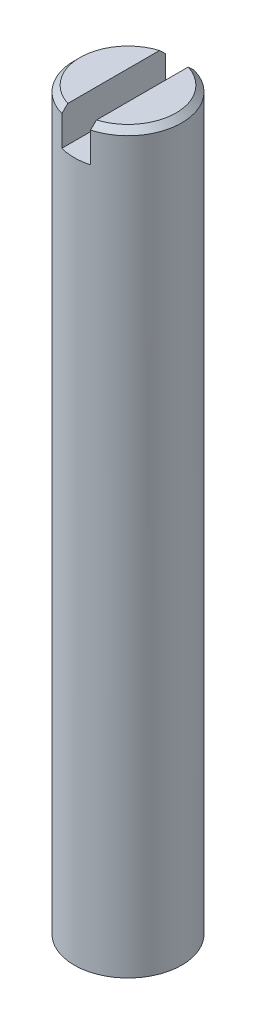
ISO-10303-21;
HEADER;
FILE_DESCRIPTION(('STEP AP214'),'2;1');
FILE_NAME('part.step','',(''),(''),'','','');
FILE_SCHEMA(('AUTOMOTIVE_DESIGN { 1 0 10303 214 1 1 1 1 }'));
ENDSEC;
DATA;
#1=APPLICATION_CONTEXT('core data for automotive mechanical design processes');
#2=APPLICATION_PROTOCOL_DEFINITION('international standard','automotive_design',2000,#1);
#3=PRODUCT_CONTEXT('',#1,'mechanical');
#4=PRODUCT('Part','Part','',(#3));
#5=PRODUCT_RELATED_PRODUCT_CATEGORY('part','',(#4));
#6=PRODUCT_DEFINITION_FORMATION('','',#4);
#7=PRODUCT_DEFINITION_CONTEXT('part definition',#1,'design');
#8=PRODUCT_DEFINITION('design','',#6,#7);
#9=PRODUCT_DEFINITION_SHAPE('','',#8);
#10=(LENGTH_UNIT() NAMED_UNIT(*) SI_UNIT(.MILLI.,.METRE.));
#11=(NAMED_UNIT(*) PLANE_ANGLE_UNIT() SI_UNIT($,.RADIAN.));
#12=(NAMED_UNIT(*) SI_UNIT($,.STERADIAN.) SOLID_ANGLE_UNIT());
#13=UNCERTAINTY_MEASURE_WITH_UNIT(LENGTH_MEASURE(1.E-05),#10,'distance_accuracy_value','');
#14=(GEOMETRIC_REPRESENTATION_CONTEXT(3) GLOBAL_UNCERTAINTY_ASSIGNED_CONTEXT((#13)) GLOBAL_UNIT_ASSIGNED_CONTEXT((#10,
#11,#12)) REPRESENTATION_CONTEXT('',''));
#15=CARTESIAN_POINT('',(0.,0.,0.));
#16=DIRECTION('',(0.,0.,1.));
#17=DIRECTION('',(1.,0.,0.));
#18=AXIS2_PLACEMENT_3D('',#15,#16,#17);
#19=CARTESIAN_POINT('',(0.,2.563,0.));
#20=DIRECTION('',(0.,1.,0.));
#21=DIRECTION('',(0.,0.,1.));
#22=AXIS2_PLACEMENT_3D('',#19,#20,#21);
#23=PLANE('',#22);
#24=DIRECTION('',(0.,0.,-1.));
#25=VECTOR('',#24,1.);
#26=CARTESIAN_POINT('',(0.05,2.563,0.));
#27=LINE('',#26,#25);
#28=CARTESIAN_POINT('',(0.05,2.563,0.159863222787482));
#29=VERTEX_POINT('',#28);
#30=CARTESIAN_POINT('',(0.05,2.563,-0.159863222787482));
#31=VERTEX_POINT('',#30);
#32=EDGE_CURVE('E152',#29,#31,#27,.T.);
#33=ORIENTED_EDGE('',*,*,#32,.F.);
#34=CARTESIAN_POINT('',(0.,2.563,0.));
#35=DIRECTION('',(0.,1.,0.));
#36=DIRECTION('',(0.,0.,1.));
#37=AXIS2_PLACEMENT_3D('',#34,#35,#36);
#38=CIRCLE('',#37,0.1675);
#39=EDGE_CURVE('E194',#29,#31,#38,.T.);
#40=ORIENTED_EDGE('',*,*,#39,.T.);
#41=EDGE_LOOP('',(#33,#40));
#42=FACE_BOUND('',#41,.T.);
#43=ADVANCED_FACE('F41',(#42),#23,.T.);
#44=CARTESIAN_POINT('',(0.,2.563,0.));
#45=DIRECTION('',(0.,-1.,0.));
#46=DIRECTION('',(0.,0.,-1.));
#47=AXIS2_PLACEMENT_3D('',#44,#45,#46);
#48=CYLINDRICAL_SURFACE('',#47,0.1875);
#49=DIRECTION('',(0.,-1.,0.));
#50=VECTOR('',#49,1.);
#51=CARTESIAN_POINT('',(-0.05,2.563,0.180710403685012));
#52=LINE('',#51,#50);
#53=CARTESIAN_POINT('',(-0.05,2.438,0.180710403685012));
#54=VERTEX_POINT('',#53);
#55=CARTESIAN_POINT('',(-0.05,2.543,0.180710403685012));
#56=VERTEX_POINT('',#55);
#57=EDGE_CURVE('E116',#54,#56,#52,.F.);
#58=ORIENTED_EDGE('',*,*,#57,.T.);
#59=CARTESIAN_POINT('',(0.,2.543,0.));
#60=DIRECTION('',(0.,1.,0.));
#61=DIRECTION('',(0.,0.,1.));
#62=AXIS2_PLACEMENT_3D('',#59,#60,#61);
#63=CIRCLE('',#62,0.1875);
#64=CARTESIAN_POINT('',(-0.05,2.543,-0.180710403685012));
#65=VERTEX_POINT('',#64);
#66=EDGE_CURVE('E110',#56,#65,#63,.F.);
#67=ORIENTED_EDGE('',*,*,#66,.T.);
#68=DIRECTION('',(0.,-1.,0.));
#69=VECTOR('',#68,1.);
#70=CARTESIAN_POINT('',(-0.05,2.563,-0.180710403685012));
#71=LINE('',#70,#69);
#72=CARTESIAN_POINT('',(-0.05,2.438,-0.180710403685012));
#73=VERTEX_POINT('',#72);
#74=EDGE_CURVE('E102',#65,#73,#71,.T.);
#75=ORIENTED_EDGE('',*,*,#74,.T.);
#76=CARTESIAN_POINT('',(0.,2.438,0.));
#77=DIRECTION('',(0.,1.,0.));
#78=DIRECTION('',(0.,0.,1.));
#79=AXIS2_PLACEMENT_3D('',#76,#77,#78);
#80=CIRCLE('',#79,0.1875);
#81=CARTESIAN_POINT('',(0.05,2.438,-0.180710403685012));
#82=VERTEX_POINT('',#81);
#83=EDGE_CURVE('E108',#82,#73,#80,.T.);
#84=ORIENTED_EDGE('',*,*,#83,.F.);
#85=DIRECTION('',(0.,-1.,0.));
#86=VECTOR('',#85,1.);
#87=CARTESIAN_POINT('',(0.05,2.563,-0.180710403685012));
#88=LINE('',#87,#86);
#89=CARTESIAN_POINT('',(0.05,2.543,-0.180710403685012));
#90=VERTEX_POINT('',#89);
#91=EDGE_CURVE('E115',#82,#90,#88,.F.);
#92=ORIENTED_EDGE('',*,*,#91,.T.);
#93=CARTESIAN_POINT('',(0.,2.543,0.));
#94=DIRECTION('',(0.,1.,0.));
#95=DIRECTION('',(0.,0.,1.));
#96=AXIS2_PLACEMENT_3D('',#93,#94,#95);
#97=CIRCLE('',#96,0.1875);
#98=CARTESIAN_POINT('',(0.05,2.543,0.180710403685012));
#99=VERTEX_POINT('',#98);
#100=EDGE_CURVE('E198',#90,#99,#97,.F.);
#101=ORIENTED_EDGE('',*,*,#100,.T.);
#102=DIRECTION('',(0.,-1.,0.));
#103=VECTOR('',#102,1.);
#104=CARTESIAN_POINT('',(0.05,2.563,0.180710403685012));
#105=LINE('',#104,#103);
#106=CARTESIAN_POINT('',(0.05,2.438,0.180710403685012));
#107=VERTEX_POINT('',#106);
#108=EDGE_CURVE('E142',#99,#107,#105,.T.);
#109=ORIENTED_EDGE('',*,*,#108,.T.);
#110=EDGE_CURVE('E129',#54,#107,#80,.T.);
#111=ORIENTED_EDGE('',*,*,#110,.F.);
#112=EDGE_LOOP('',(#58,#67,#75,#84,#92,#101,#109,#111));
#113=FACE_BOUND('',#112,.T.);
#114=CARTESIAN_POINT('',(0.,0.,0.));
#115=DIRECTION('',(0.,1.,0.));
#116=DIRECTION('',(0.,0.,1.));
#117=AXIS2_PLACEMENT_3D('',#114,#115,#116);
#118=CIRCLE('',#117,0.1875);
#119=CARTESIAN_POINT('',(0.,0.,0.1875));
#120=VERTEX_POINT('',#119);
#121=EDGE_CURVE('E145',#120,#120,#118,.T.);
#122=ORIENTED_EDGE('',*,*,#121,.T.);
#123=EDGE_LOOP('',(#122));
#124=FACE_BOUND('',#123,.T.);
#125=ADVANCED_FACE('F105',(#113,#124),#48,.T.);
#126=DIRECTION('',(0.,0.,1.));
#127=VECTOR('',#126,1.);
#128=CARTESIAN_POINT('',(-0.05,2.563,0.));
#129=LINE('',#128,#127);
#130=CARTESIAN_POINT('',(-0.05,2.563,-0.159863222787482));
#131=VERTEX_POINT('',#130);
#132=CARTESIAN_POINT('',(-0.05,2.563,0.159863222787482));
#133=VERTEX_POINT('',#132);
#134=EDGE_CURVE('E149',#131,#133,#129,.T.);
#135=ORIENTED_EDGE('',*,*,#134,.F.);
#136=CARTESIAN_POINT('',(0.,2.563,0.));
#137=DIRECTION('',(0.,1.,0.));
#138=DIRECTION('',(0.,0.,1.));
#139=AXIS2_PLACEMENT_3D('',#136,#137,#138);
#140=CIRCLE('',#139,0.1675);
#141=EDGE_CURVE('E128',#131,#133,#140,.T.);
#142=ORIENTED_EDGE('',*,*,#141,.T.);
#143=EDGE_LOOP('',(#135,#142));
#144=FACE_BOUND('',#143,.T.);
#145=ADVANCED_FACE('F185',(#144),#23,.T.);
#146=CARTESIAN_POINT('',(0.,0.,0.));
#147=DIRECTION('',(0.,1.,0.));
#148=DIRECTION('',(0.,0.,1.));
#149=AXIS2_PLACEMENT_3D('',#146,#147,#148);
#150=PLANE('',#149);
#151=ORIENTED_EDGE('',*,*,#121,.F.);
#152=EDGE_LOOP('',(#151));
#153=FACE_BOUND('',#152,.T.);
#154=ADVANCED_FACE('F206',(#153),#150,.F.);
#155=CARTESIAN_POINT('',(0.,2.438,0.));
#156=DIRECTION('',(0.,1.,0.));
#157=DIRECTION('',(0.,0.,1.));
#158=AXIS2_PLACEMENT_3D('',#155,#156,#157);
#159=PLANE('',#158);
#160=ORIENTED_EDGE('',*,*,#83,.T.);
#161=DIRECTION('',(0.,0.,1.));
#162=VECTOR('',#161,1.);
#163=CARTESIAN_POINT('',(-0.05,2.438,-0.246718473533828));
#164=LINE('',#163,#162);
#165=EDGE_CURVE('E123',#73,#54,#164,.T.);
#166=ORIENTED_EDGE('',*,*,#165,.T.);
#167=ORIENTED_EDGE('',*,*,#110,.T.);
#168=DIRECTION('',(0.,0.,-1.));
#169=VECTOR('',#168,1.);
#170=CARTESIAN_POINT('',(0.05,2.438,-0.246718473533828));
#171=LINE('',#170,#169);
#172=EDGE_CURVE('E126',#107,#82,#171,.T.);
#173=ORIENTED_EDGE('',*,*,#172,.T.);
#174=EDGE_LOOP('',(#160,#166,#167,#173));
#175=FACE_BOUND('',#174,.T.);
#176=ADVANCED_FACE('F121',(#175),#159,.T.);
#177=CARTESIAN_POINT('',(0.05,2.438,-0.246718473533828));
#178=DIRECTION('',(1.,0.,0.));
#179=DIRECTION('',(0.,0.,-1.));
#180=AXIS2_PLACEMENT_3D('',#177,#178,#179);
#181=PLANE('',#180);
#182=ORIENTED_EDGE('',*,*,#32,.T.);
#183=CARTESIAN_POINT('',(0.05,2.563,-0.159863222787482));
#184=CARTESIAN_POINT('',(0.05,2.55967512645176,-0.163345869493428));
#185=CARTESIAN_POINT('',(0.05,2.55634602287143,-0.166824458065941));
#186=CARTESIAN_POINT('',(0.05,2.54967935620335,-0.173773518363763));
#187=CARTESIAN_POINT('',(0.05,2.54634179311701,-0.177243990090426));
#188=CARTESIAN_POINT('',(0.05,2.543,-0.180710403685012));
#189=B_SPLINE_CURVE_WITH_KNOTS('',3,(#183,#184,#185,#186,#187,#188),.UNSPECIFIED.,.F.,.F.,(4,2,
4),(0.,0.0144447769781474,0.0288895515436328),.UNSPECIFIED.);
#190=EDGE_CURVE('E11',#31,#90,#189,.T.);
#191=ORIENTED_EDGE('',*,*,#190,.T.);
#192=ORIENTED_EDGE('',*,*,#91,.F.);
#193=ORIENTED_EDGE('',*,*,#172,.F.);
#194=ORIENTED_EDGE('',*,*,#108,.F.);
#195=CARTESIAN_POINT('',(0.05,2.543,0.180710403685012));
#196=CARTESIAN_POINT('',(0.05,2.54634179311701,0.177243990090426));
#197=CARTESIAN_POINT('',(0.05,2.54967935620335,0.173773518363762));
#198=CARTESIAN_POINT('',(0.05,2.55634602287143,0.166824458065941));
#199=CARTESIAN_POINT('',(0.05,2.55967512645176,0.163345869493428));
#200=CARTESIAN_POINT('',(0.05,2.563,0.159863222787482));
#201=B_SPLINE_CURVE_WITH_KNOTS('',3,(#195,#196,#197,#198,#199,#200),.UNSPECIFIED.,.F.,.F.,(4,2,
4),(0.,0.0144447745654854,0.0288895515436327),.UNSPECIFIED.);
#202=EDGE_CURVE('E57',#99,#29,#201,.T.);
#203=ORIENTED_EDGE('',*,*,#202,.T.);
#204=EDGE_LOOP('',(#182,#191,#192,#193,#194,#203));
#205=FACE_BOUND('',#204,.T.);
#206=ADVANCED_FACE('F180',(#205),#181,.F.);
#207=CARTESIAN_POINT('',(-0.05,2.438,-0.246718473533828));
#208=DIRECTION('',(-1.,0.,0.));
#209=DIRECTION('',(0.,0.,1.));
#210=AXIS2_PLACEMENT_3D('',#207,#208,#209);
#211=PLANE('',#210);
#212=ORIENTED_EDGE('',*,*,#134,.T.);
#213=CARTESIAN_POINT('',(-0.05,2.563,0.159863222787482));
#214=CARTESIAN_POINT('',(-0.05,2.55967512645176,0.163345869493428));
#215=CARTESIAN_POINT('',(-0.05,2.55634602287143,0.166824458065941));
#216=CARTESIAN_POINT('',(-0.05,2.54967935620335,0.173773518363763));
#217=CARTESIAN_POINT('',(-0.05,2.54634179311701,0.177243990090426));
#218=CARTESIAN_POINT('',(-0.05,2.543,0.180710403685012));
#219=B_SPLINE_CURVE_WITH_KNOTS('',3,(#213,#214,#215,#216,#217,#218),.UNSPECIFIED.,.F.,.F.,(4,2,
4),(0.,0.0144447769781474,0.0288895515436328),.UNSPECIFIED.);
#220=EDGE_CURVE('E167',#133,#56,#219,.T.);
#221=ORIENTED_EDGE('',*,*,#220,.T.);
#222=ORIENTED_EDGE('',*,*,#57,.F.);
#223=ORIENTED_EDGE('',*,*,#165,.F.);
#224=ORIENTED_EDGE('',*,*,#74,.F.);
#225=CARTESIAN_POINT('',(-0.05,2.543,-0.180710403685012));
#226=CARTESIAN_POINT('',(-0.05,2.54634179311701,-0.177243990090426));
#227=CARTESIAN_POINT('',(-0.05,2.54967935620335,-0.173773518363762));
#228=CARTESIAN_POINT('',(-0.05,2.55634602287143,-0.166824458065941));
#229=CARTESIAN_POINT('',(-0.05,2.55967512645176,-0.163345869493428));
#230=CARTESIAN_POINT('',(-0.05,2.563,-0.159863222787482));
#231=B_SPLINE_CURVE_WITH_KNOTS('',3,(#225,#226,#227,#228,#229,#230),.UNSPECIFIED.,.F.,.F.,(4,2,
4),(0.,0.0144447745654854,0.0288895515436327),.UNSPECIFIED.);
#232=EDGE_CURVE('E159',#65,#131,#231,.T.);
#233=ORIENTED_EDGE('',*,*,#232,.T.);
#234=EDGE_LOOP('',(#212,#221,#222,#223,#224,#233));
#235=FACE_BOUND('',#234,.T.);
#236=ADVANCED_FACE('F132',(#235),#211,.F.);
#237=CARTESIAN_POINT('',(0.,2.563,0.));
#238=DIRECTION('',(0.,-1.,0.));
#239=DIRECTION('',(0.,0.,-1.));
#240=AXIS2_PLACEMENT_3D('',#237,#238,#239);
#241=CONICAL_SURFACE('',#240,0.1675,0.78539816339745);
#242=ORIENTED_EDGE('',*,*,#232,.F.);
#243=ORIENTED_EDGE('',*,*,#66,.F.);
#244=ORIENTED_EDGE('',*,*,#220,.F.);
#245=ORIENTED_EDGE('',*,*,#141,.F.);
#246=EDGE_LOOP('',(#242,#243,#244,#245));
#247=FACE_BOUND('',#246,.T.);
#248=ADVANCED_FACE('F174',(#247),#241,.T.);
#249=CARTESIAN_POINT('',(0.,2.563,0.));
#250=DIRECTION('',(0.,-1.,0.));
#251=DIRECTION('',(0.,0.,-1.));
#252=AXIS2_PLACEMENT_3D('',#249,#250,#251);
#253=CONICAL_SURFACE('',#252,0.1675,0.78539816339745);
#254=ORIENTED_EDGE('',*,*,#202,.F.);
#255=ORIENTED_EDGE('',*,*,#100,.F.);
#256=ORIENTED_EDGE('',*,*,#190,.F.);
#257=ORIENTED_EDGE('',*,*,#39,.F.);
#258=EDGE_LOOP('',(#254,#255,#256,#257));
#259=FACE_BOUND('',#258,.T.);
#260=ADVANCED_FACE('F44',(#259),#253,.T.);
#261=CLOSED_SHELL('',(#43,#125,#145,#154,#176,#206,#236,#248,#260));
#262=MANIFOLD_SOLID_BREP('B2',#261);
#263=ADVANCED_BREP_SHAPE_REPRESENTATION('',(#18,#262),#14);
#264=SHAPE_DEFINITION_REPRESENTATION(#9,#263);
ENDSEC;
END-ISO-10303-21;
